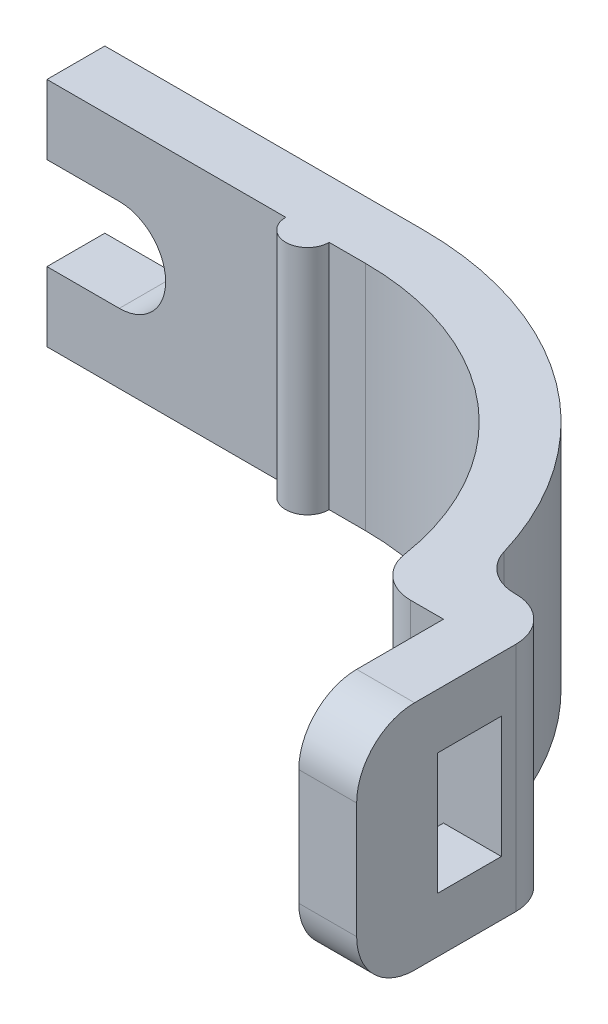
ISO-10303-21;
HEADER;
FILE_DESCRIPTION(('STEP AP214'),'2;1');
FILE_NAME('part.step','',(''),(''),'','','');
FILE_SCHEMA(('AUTOMOTIVE_DESIGN { 1 0 10303 214 1 1 1 1 }'));
ENDSEC;
DATA;
#1=APPLICATION_CONTEXT('core data for automotive mechanical design processes');
#2=APPLICATION_PROTOCOL_DEFINITION('international standard','automotive_design',2000,#1);
#3=PRODUCT_CONTEXT('',#1,'mechanical');
#4=PRODUCT('Part','Part','',(#3));
#5=PRODUCT_RELATED_PRODUCT_CATEGORY('part','',(#4));
#6=PRODUCT_DEFINITION_FORMATION('','',#4);
#7=PRODUCT_DEFINITION_CONTEXT('part definition',#1,'design');
#8=PRODUCT_DEFINITION('design','',#6,#7);
#9=PRODUCT_DEFINITION_SHAPE('','',#8);
#10=(LENGTH_UNIT() NAMED_UNIT(*) SI_UNIT(.MILLI.,.METRE.));
#11=(NAMED_UNIT(*) PLANE_ANGLE_UNIT() SI_UNIT($,.RADIAN.));
#12=(NAMED_UNIT(*) SI_UNIT($,.STERADIAN.) SOLID_ANGLE_UNIT());
#13=UNCERTAINTY_MEASURE_WITH_UNIT(LENGTH_MEASURE(1.E-05),#10,'distance_accuracy_value','');
#14=(GEOMETRIC_REPRESENTATION_CONTEXT(3) GLOBAL_UNCERTAINTY_ASSIGNED_CONTEXT((#13)) GLOBAL_UNIT_ASSIGNED_CONTEXT((#10,
#11,#12)) REPRESENTATION_CONTEXT('',''));
#15=CARTESIAN_POINT('',(0.,0.,0.));
#16=DIRECTION('',(0.,0.,1.));
#17=DIRECTION('',(1.,0.,0.));
#18=AXIS2_PLACEMENT_3D('',#15,#16,#17);
#19=CARTESIAN_POINT('',(0.,8.,-9.5));
#20=DIRECTION('',(0.,0.,1.));
#21=DIRECTION('',(1.,0.,0.));
#22=AXIS2_PLACEMENT_3D('',#19,#20,#21);
#23=PLANE('',#22);
#24=DIRECTION('',(0.,1.,0.));
#25=VECTOR('',#24,1.);
#26=CARTESIAN_POINT('',(-1.25,-2.12132034355965,-9.5));
#27=LINE('',#26,#25);
#28=CARTESIAN_POINT('',(-1.25,0.,-9.5));
#29=VERTEX_POINT('',#28);
#30=CARTESIAN_POINT('',(-1.25,8.,-9.5));
#31=VERTEX_POINT('',#30);
#32=EDGE_CURVE('E206',#29,#31,#27,.T.);
#33=ORIENTED_EDGE('',*,*,#32,.F.);
#34=DIRECTION('',(-1.,0.,0.));
#35=VECTOR('',#34,1.);
#36=CARTESIAN_POINT('',(0.,0.,-9.5));
#37=LINE('',#36,#35);
#38=CARTESIAN_POINT('',(0.,0.,-9.5));
#39=VERTEX_POINT('',#38);
#40=EDGE_CURVE('E217',#39,#29,#37,.T.);
#41=ORIENTED_EDGE('',*,*,#40,.F.);
#42=DIRECTION('',(0.,-1.,0.));
#43=VECTOR('',#42,1.);
#44=CARTESIAN_POINT('',(0.,8.,-9.5));
#45=LINE('',#44,#43);
#46=CARTESIAN_POINT('',(0.,8.,-9.5));
#47=VERTEX_POINT('',#46);
#48=EDGE_CURVE('E259',#47,#39,#45,.T.);
#49=ORIENTED_EDGE('',*,*,#48,.F.);
#50=DIRECTION('',(-1.,0.,0.));
#51=VECTOR('',#50,1.);
#52=CARTESIAN_POINT('',(0.,8.,-9.5));
#53=LINE('',#52,#51);
#54=EDGE_CURVE('E219',#47,#31,#53,.T.);
#55=ORIENTED_EDGE('',*,*,#54,.T.);
#56=EDGE_LOOP('',(#33,#41,#49,#55));
#57=FACE_BOUND('',#56,.T.);
#58=ADVANCED_FACE('F38',(#57),#23,.T.);
#59=CARTESIAN_POINT('',(-11.,8.,-9.5));
#60=DIRECTION('',(-1.,0.,0.));
#61=DIRECTION('',(0.,0.,1.));
#62=AXIS2_PLACEMENT_3D('',#59,#60,#61);
#63=PLANE('',#62);
#64=DIRECTION('',(0.,0.,-1.));
#65=VECTOR('',#64,1.);
#66=CARTESIAN_POINT('',(-11.,2.4,4.801));
#67=LINE('',#66,#65);
#68=CARTESIAN_POINT('',(-11.,2.4,-9.5));
#69=VERTEX_POINT('',#68);
#70=CARTESIAN_POINT('',(-11.,2.4,-11.5));
#71=VERTEX_POINT('',#70);
#72=EDGE_CURVE('E378',#69,#71,#67,.T.);
#73=ORIENTED_EDGE('',*,*,#72,.T.);
#74=DIRECTION('',(0.,-1.,0.));
#75=VECTOR('',#74,1.);
#76=CARTESIAN_POINT('',(-11.,8.,-11.5));
#77=LINE('',#76,#75);
#78=CARTESIAN_POINT('',(-11.,0.,-11.5));
#79=VERTEX_POINT('',#78);
#80=EDGE_CURVE('E265',#71,#79,#77,.T.);
#81=ORIENTED_EDGE('',*,*,#80,.T.);
#82=DIRECTION('',(0.,0.,-1.));
#83=VECTOR('',#82,1.);
#84=CARTESIAN_POINT('',(-11.,0.,-9.5));
#85=LINE('',#84,#83);
#86=CARTESIAN_POINT('',(-11.,0.,-9.5));
#87=VERTEX_POINT('',#86);
#88=EDGE_CURVE('E230',#87,#79,#85,.T.);
#89=ORIENTED_EDGE('',*,*,#88,.F.);
#90=DIRECTION('',(0.,-1.,0.));
#91=VECTOR('',#90,1.);
#92=CARTESIAN_POINT('',(-11.,8.,-9.5));
#93=LINE('',#92,#91);
#94=EDGE_CURVE('E261',#69,#87,#93,.T.);
#95=ORIENTED_EDGE('',*,*,#94,.F.);
#96=EDGE_LOOP('',(#73,#81,#89,#95));
#97=FACE_BOUND('',#96,.T.);
#98=ADVANCED_FACE('F442',(#97),#63,.T.);
#99=CARTESIAN_POINT('',(0.,8.,-11.5));
#100=DIRECTION('',(0.,0.,1.));
#101=DIRECTION('',(1.,0.,0.));
#102=AXIS2_PLACEMENT_3D('',#99,#100,#101);
#103=PLANE('',#102);
#104=ORIENTED_EDGE('',*,*,#80,.F.);
#105=DIRECTION('',(-1.,0.,0.));
#106=VECTOR('',#105,1.);
#107=CARTESIAN_POINT('',(-11.,2.4,-11.5));
#108=LINE('',#107,#106);
#109=CARTESIAN_POINT('',(-8.5,2.4,-11.5));
#110=VERTEX_POINT('',#109);
#111=EDGE_CURVE('E393',#110,#71,#108,.T.);
#112=ORIENTED_EDGE('',*,*,#111,.F.);
#113=CARTESIAN_POINT('',(-8.5,4.,-11.5));
#114=DIRECTION('',(0.,0.,-1.));
#115=DIRECTION('',(-1.,0.,0.));
#116=AXIS2_PLACEMENT_3D('',#113,#114,#115);
#117=CIRCLE('',#116,1.6);
#118=CARTESIAN_POINT('',(-8.5,5.6,-11.5));
#119=VERTEX_POINT('',#118);
#120=EDGE_CURVE('E390',#119,#110,#117,.T.);
#121=ORIENTED_EDGE('',*,*,#120,.F.);
#122=DIRECTION('',(1.,0.,0.));
#123=VECTOR('',#122,1.);
#124=CARTESIAN_POINT('',(-11.,5.6,-11.5));
#125=LINE('',#124,#123);
#126=CARTESIAN_POINT('',(-11.,5.6,-11.5));
#127=VERTEX_POINT('',#126);
#128=EDGE_CURVE('E387',#127,#119,#125,.T.);
#129=ORIENTED_EDGE('',*,*,#128,.F.);
#130=CARTESIAN_POINT('',(-11.,8.,-11.5));
#131=VERTEX_POINT('',#130);
#132=EDGE_CURVE('E266',#131,#127,#77,.T.);
#133=ORIENTED_EDGE('',*,*,#132,.F.);
#134=DIRECTION('',(-1.,0.,0.));
#135=VECTOR('',#134,1.);
#136=CARTESIAN_POINT('',(0.,8.,-11.5));
#137=LINE('',#136,#135);
#138=CARTESIAN_POINT('',(0.,8.,-11.5));
#139=VERTEX_POINT('',#138);
#140=EDGE_CURVE('E245',#139,#131,#137,.T.);
#141=ORIENTED_EDGE('',*,*,#140,.F.);
#142=DIRECTION('',(0.,-1.,0.));
#143=VECTOR('',#142,1.);
#144=CARTESIAN_POINT('',(0.,8.,-11.5));
#145=LINE('',#144,#143);
#146=CARTESIAN_POINT('',(0.,0.,-11.5));
#147=VERTEX_POINT('',#146);
#148=EDGE_CURVE('E246',#139,#147,#145,.T.);
#149=ORIENTED_EDGE('',*,*,#148,.T.);
#150=DIRECTION('',(-1.,0.,0.));
#151=VECTOR('',#150,1.);
#152=CARTESIAN_POINT('',(0.,0.,-11.5));
#153=LINE('',#152,#151);
#154=EDGE_CURVE('E342',#147,#79,#153,.T.);
#155=ORIENTED_EDGE('',*,*,#154,.T.);
#156=EDGE_LOOP('',(#104,#112,#121,#129,#133,#141,#149,#155));
#157=FACE_BOUND('',#156,.T.);
#158=ADVANCED_FACE('F448',(#157),#103,.F.);
#159=DIRECTION('',(0.,0.,1.));
#160=VECTOR('',#159,1.);
#161=CARTESIAN_POINT('',(-11.,5.6,4.801));
#162=LINE('',#161,#160);
#163=CARTESIAN_POINT('',(-11.,5.6,-9.5));
#164=VERTEX_POINT('',#163);
#165=EDGE_CURVE('E220',#127,#164,#162,.T.);
#166=ORIENTED_EDGE('',*,*,#165,.T.);
#167=CARTESIAN_POINT('',(-11.,8.,-9.5));
#168=VERTEX_POINT('',#167);
#169=EDGE_CURVE('E262',#168,#164,#93,.T.);
#170=ORIENTED_EDGE('',*,*,#169,.F.);
#171=DIRECTION('',(0.,0.,-1.));
#172=VECTOR('',#171,1.);
#173=CARTESIAN_POINT('',(-11.,8.,-9.5));
#174=LINE('',#173,#172);
#175=EDGE_CURVE('E363',#168,#131,#174,.T.);
#176=ORIENTED_EDGE('',*,*,#175,.T.);
#177=ORIENTED_EDGE('',*,*,#132,.T.);
#178=EDGE_LOOP('',(#166,#170,#176,#177));
#179=FACE_BOUND('',#178,.T.);
#180=ADVANCED_FACE('F451',(#179),#63,.T.);
#181=DIRECTION('',(0.,1.,0.));
#182=VECTOR('',#181,1.);
#183=CARTESIAN_POINT('',(-2.75,-2.12132034355965,-9.5));
#184=LINE('',#183,#182);
#185=CARTESIAN_POINT('',(-2.75,8.,-9.5));
#186=VERTEX_POINT('',#185);
#187=CARTESIAN_POINT('',(-2.75,0.,-9.5));
#188=VERTEX_POINT('',#187);
#189=EDGE_CURVE('E209',#186,#188,#184,.F.);
#190=ORIENTED_EDGE('',*,*,#189,.F.);
#191=EDGE_CURVE('E366',#186,#168,#53,.T.);
#192=ORIENTED_EDGE('',*,*,#191,.T.);
#193=ORIENTED_EDGE('',*,*,#169,.T.);
#194=DIRECTION('',(1.,0.,0.));
#195=VECTOR('',#194,1.);
#196=CARTESIAN_POINT('',(-11.,5.6,-9.5));
#197=LINE('',#196,#195);
#198=CARTESIAN_POINT('',(-8.5,5.6,-9.5));
#199=VERTEX_POINT('',#198);
#200=EDGE_CURVE('E398',#164,#199,#197,.T.);
#201=ORIENTED_EDGE('',*,*,#200,.T.);
#202=CARTESIAN_POINT('',(-8.5,4.,-9.5));
#203=DIRECTION('',(0.,0.,1.));
#204=DIRECTION('',(1.,0.,0.));
#205=AXIS2_PLACEMENT_3D('',#202,#203,#204);
#206=CIRCLE('',#205,1.6);
#207=CARTESIAN_POINT('',(-8.5,2.4,-9.5));
#208=VERTEX_POINT('',#207);
#209=EDGE_CURVE('E381',#199,#208,#206,.F.);
#210=ORIENTED_EDGE('',*,*,#209,.T.);
#211=DIRECTION('',(-1.,0.,0.));
#212=VECTOR('',#211,1.);
#213=CARTESIAN_POINT('',(-11.,2.4,-9.5));
#214=LINE('',#213,#212);
#215=EDGE_CURVE('E384',#208,#69,#214,.T.);
#216=ORIENTED_EDGE('',*,*,#215,.T.);
#217=ORIENTED_EDGE('',*,*,#94,.T.);
#218=EDGE_CURVE('E226',#188,#87,#37,.T.);
#219=ORIENTED_EDGE('',*,*,#218,.F.);
#220=EDGE_LOOP('',(#190,#192,#193,#201,#210,#216,#217,#219));
#221=FACE_BOUND('',#220,.T.);
#222=ADVANCED_FACE('F444',(#221),#23,.T.);
#223=CARTESIAN_POINT('',(0.,8.,0.));
#224=DIRECTION('',(0.,-1.,0.));
#225=DIRECTION('',(0.,0.,-1.));
#226=AXIS2_PLACEMENT_3D('',#223,#224,#225);
#227=CYLINDRICAL_SURFACE('',#226,9.5);
#228=CARTESIAN_POINT('',(0.,0.,0.));
#229=DIRECTION('',(0.,1.,0.));
#230=DIRECTION('',(0.,0.,1.));
#231=AXIS2_PLACEMENT_3D('',#228,#229,#230);
#232=CIRCLE('',#231,9.5);
#233=CARTESIAN_POINT('',(9.38586395324162,0.,-1.46818181818182));
#234=VERTEX_POINT('',#233);
#235=EDGE_CURVE('E224',#234,#39,#232,.T.);
#236=ORIENTED_EDGE('',*,*,#235,.F.);
#237=DIRECTION('',(0.,-1.,0.));
#238=VECTOR('',#237,1.);
#239=CARTESIAN_POINT('',(9.38586395324162,8.,-1.46818181818182));
#240=LINE('',#239,#238);
#241=CARTESIAN_POINT('',(9.38586395324162,8.,-1.46818181818182));
#242=VERTEX_POINT('',#241);
#243=EDGE_CURVE('E292',#234,#242,#240,.F.);
#244=ORIENTED_EDGE('',*,*,#243,.T.);
#245=CARTESIAN_POINT('',(0.,8.,0.));
#246=DIRECTION('',(0.,1.,0.));
#247=DIRECTION('',(0.,0.,1.));
#248=AXIS2_PLACEMENT_3D('',#245,#246,#247);
#249=CIRCLE('',#248,9.5);
#250=EDGE_CURVE('E336',#242,#47,#249,.T.);
#251=ORIENTED_EDGE('',*,*,#250,.T.);
#252=ORIENTED_EDGE('',*,*,#48,.T.);
#253=EDGE_LOOP('',(#236,#244,#251,#252));
#254=FACE_BOUND('',#253,.T.);
#255=ADVANCED_FACE('F369',(#254),#227,.F.);
#256=CARTESIAN_POINT('',(9.49789450352024,8.,-0.2));
#257=DIRECTION('',(0.,0.,1.));
#258=DIRECTION('',(1.,0.,0.));
#259=AXIS2_PLACEMENT_3D('',#256,#257,#258);
#260=PLANE('',#259);
#261=DIRECTION('',(-1.,0.,0.));
#262=VECTOR('',#261,1.);
#263=CARTESIAN_POINT('',(9.49789450352024,8.,-0.2));
#264=LINE('',#263,#262);
#265=CARTESIAN_POINT('',(12.,8.,-0.2));
#266=VERTEX_POINT('',#265);
#267=CARTESIAN_POINT('',(10.8678424721745,8.,-0.2));
#268=VERTEX_POINT('',#267);
#269=EDGE_CURVE('E332',#266,#268,#264,.T.);
#270=ORIENTED_EDGE('',*,*,#269,.T.);
#271=DIRECTION('',(0.,-1.,0.));
#272=VECTOR('',#271,1.);
#273=CARTESIAN_POINT('',(10.8678424721745,8.,-0.2));
#274=LINE('',#273,#272);
#275=CARTESIAN_POINT('',(10.8678424721745,0.,-0.2));
#276=VERTEX_POINT('',#275);
#277=EDGE_CURVE('E289',#268,#276,#274,.T.);
#278=ORIENTED_EDGE('',*,*,#277,.T.);
#279=DIRECTION('',(-1.,0.,0.));
#280=VECTOR('',#279,1.);
#281=CARTESIAN_POINT('',(9.49789450352024,0.,-0.2));
#282=LINE('',#281,#280);
#283=CARTESIAN_POINT('',(12.,0.,-0.2));
#284=VERTEX_POINT('',#283);
#285=EDGE_CURVE('E228',#284,#276,#282,.T.);
#286=ORIENTED_EDGE('',*,*,#285,.F.);
#287=DIRECTION('',(0.,-1.,0.));
#288=VECTOR('',#287,1.);
#289=CARTESIAN_POINT('',(12.,8.,-0.2));
#290=LINE('',#289,#288);
#291=CARTESIAN_POINT('',(12.,1.9,-0.2));
#292=VERTEX_POINT('',#291);
#293=EDGE_CURVE('E255',#292,#284,#290,.T.);
#294=ORIENTED_EDGE('',*,*,#293,.F.);
#295=DIRECTION('',(-1.,0.,0.));
#296=VECTOR('',#295,1.);
#297=CARTESIAN_POINT('',(14.001,1.9,-0.199999999999999));
#298=LINE('',#297,#296);
#299=CARTESIAN_POINT('',(14.,1.9,-0.199999999999999));
#300=VERTEX_POINT('',#299);
#301=EDGE_CURVE('E360',#300,#292,#298,.T.);
#302=ORIENTED_EDGE('',*,*,#301,.F.);
#303=DIRECTION('',(0.,1.,0.));
#304=VECTOR('',#303,1.);
#305=CARTESIAN_POINT('',(14.,6.1,-0.2));
#306=LINE('',#305,#304);
#307=CARTESIAN_POINT('',(14.,6.1,-0.2));
#308=VERTEX_POINT('',#307);
#309=EDGE_CURVE('E407',#300,#308,#306,.T.);
#310=ORIENTED_EDGE('',*,*,#309,.T.);
#311=DIRECTION('',(-1.,0.,0.));
#312=VECTOR('',#311,1.);
#313=CARTESIAN_POINT('',(14.001,6.1,-0.2));
#314=LINE('',#313,#312);
#315=CARTESIAN_POINT('',(12.,6.1,-0.2));
#316=VERTEX_POINT('',#315);
#317=EDGE_CURVE('E350',#308,#316,#314,.T.);
#318=ORIENTED_EDGE('',*,*,#317,.T.);
#319=EDGE_CURVE('E256',#266,#316,#290,.T.);
#320=ORIENTED_EDGE('',*,*,#319,.F.);
#321=EDGE_LOOP('',(#270,#278,#286,#294,#302,#310,#318,#320));
#322=FACE_BOUND('',#321,.T.);
#323=ADVANCED_FACE('F430',(#322),#260,.T.);
#324=CARTESIAN_POINT('',(12.,8.,-0.2));
#325=DIRECTION('',(-1.,0.,0.));
#326=DIRECTION('',(0.,0.,1.));
#327=AXIS2_PLACEMENT_3D('',#324,#325,#326);
#328=PLANE('',#327);
#329=DIRECTION('',(0.,-1.,0.));
#330=VECTOR('',#329,1.);
#331=CARTESIAN_POINT('',(12.,8.,4.8));
#332=LINE('',#331,#330);
#333=CARTESIAN_POINT('',(12.,6.,4.8));
#334=VERTEX_POINT('',#333);
#335=CARTESIAN_POINT('',(12.,2.,4.8));
#336=VERTEX_POINT('',#335);
#337=EDGE_CURVE('E252',#334,#336,#332,.T.);
#338=ORIENTED_EDGE('',*,*,#337,.F.);
#339=CARTESIAN_POINT('',(12.,6.,2.8));
#340=DIRECTION('',(-1.,0.,0.));
#341=DIRECTION('',(0.,0.,1.));
#342=AXIS2_PLACEMENT_3D('',#339,#340,#341);
#343=CIRCLE('',#342,2.);
#344=CARTESIAN_POINT('',(12.,8.,2.8));
#345=VERTEX_POINT('',#344);
#346=EDGE_CURVE('E305',#334,#345,#343,.T.);
#347=ORIENTED_EDGE('',*,*,#346,.T.);
#348=DIRECTION('',(0.,0.,-1.));
#349=VECTOR('',#348,1.);
#350=CARTESIAN_POINT('',(12.,8.,-0.2));
#351=LINE('',#350,#349);
#352=EDGE_CURVE('E325',#345,#266,#351,.T.);
#353=ORIENTED_EDGE('',*,*,#352,.T.);
#354=ORIENTED_EDGE('',*,*,#319,.T.);
#355=DIRECTION('',(0.,0.,-1.));
#356=VECTOR('',#355,1.);
#357=CARTESIAN_POINT('',(12.,6.1,-0.2));
#358=LINE('',#357,#356);
#359=CARTESIAN_POINT('',(12.,6.1,2.));
#360=VERTEX_POINT('',#359);
#361=EDGE_CURVE('E416',#360,#316,#358,.T.);
#362=ORIENTED_EDGE('',*,*,#361,.F.);
#363=DIRECTION('',(0.,1.,0.));
#364=VECTOR('',#363,1.);
#365=CARTESIAN_POINT('',(12.,6.1,2.));
#366=LINE('',#365,#364);
#367=CARTESIAN_POINT('',(12.,1.9,2.));
#368=VERTEX_POINT('',#367);
#369=EDGE_CURVE('E413',#368,#360,#366,.T.);
#370=ORIENTED_EDGE('',*,*,#369,.F.);
#371=DIRECTION('',(0.,0.,1.));
#372=VECTOR('',#371,1.);
#373=CARTESIAN_POINT('',(12.,1.9,-0.199999999999999));
#374=LINE('',#373,#372);
#375=EDGE_CURVE('E410',#292,#368,#374,.T.);
#376=ORIENTED_EDGE('',*,*,#375,.F.);
#377=ORIENTED_EDGE('',*,*,#293,.T.);
#378=DIRECTION('',(0.,0.,-1.));
#379=VECTOR('',#378,1.);
#380=CARTESIAN_POINT('',(12.,0.,-0.2));
#381=LINE('',#380,#379);
#382=CARTESIAN_POINT('',(12.,0.,2.8));
#383=VERTEX_POINT('',#382);
#384=EDGE_CURVE('E236',#383,#284,#381,.T.);
#385=ORIENTED_EDGE('',*,*,#384,.F.);
#386=CARTESIAN_POINT('',(12.,2.,2.8));
#387=DIRECTION('',(-1.,0.,0.));
#388=DIRECTION('',(0.,0.,1.));
#389=AXIS2_PLACEMENT_3D('',#386,#387,#388);
#390=CIRCLE('',#389,2.);
#391=EDGE_CURVE('E303',#383,#336,#390,.T.);
#392=ORIENTED_EDGE('',*,*,#391,.T.);
#393=EDGE_LOOP('',(#338,#347,#353,#354,#362,#370,#376,#377,#385,#392));
#394=FACE_BOUND('',#393,.T.);
#395=ADVANCED_FACE('F324',(#394),#328,.T.);
#396=CARTESIAN_POINT('',(14.,8.,4.8));
#397=DIRECTION('',(0.,0.,1.));
#398=DIRECTION('',(1.,0.,0.));
#399=AXIS2_PLACEMENT_3D('',#396,#397,#398);
#400=PLANE('',#399);
#401=DIRECTION('',(0.,-1.,0.));
#402=VECTOR('',#401,1.);
#403=CARTESIAN_POINT('',(14.,8.,4.8));
#404=LINE('',#403,#402);
#405=CARTESIAN_POINT('',(14.,6.,4.8));
#406=VERTEX_POINT('',#405);
#407=CARTESIAN_POINT('',(14.,2.,4.8));
#408=VERTEX_POINT('',#407);
#409=EDGE_CURVE('E249',#406,#408,#404,.T.);
#410=ORIENTED_EDGE('',*,*,#409,.F.);
#411=DIRECTION('',(-1.,0.,0.));
#412=VECTOR('',#411,1.);
#413=CARTESIAN_POINT('',(14.,6.,4.8));
#414=LINE('',#413,#412);
#415=EDGE_CURVE('E300',#406,#334,#414,.T.);
#416=ORIENTED_EDGE('',*,*,#415,.T.);
#417=ORIENTED_EDGE('',*,*,#337,.T.);
#418=DIRECTION('',(-1.,0.,0.));
#419=VECTOR('',#418,1.);
#420=CARTESIAN_POINT('',(14.,2.,4.8));
#421=LINE('',#420,#419);
#422=EDGE_CURVE('E298',#336,#408,#421,.F.);
#423=ORIENTED_EDGE('',*,*,#422,.T.);
#424=EDGE_LOOP('',(#410,#416,#417,#423));
#425=FACE_BOUND('',#424,.T.);
#426=ADVANCED_FACE('F318',(#425),#400,.T.);
#427=CARTESIAN_POINT('',(14.,8.,-0.2));
#428=DIRECTION('',(-1.,0.,0.));
#429=DIRECTION('',(0.,0.,1.));
#430=AXIS2_PLACEMENT_3D('',#427,#428,#429);
#431=PLANE('',#430);
#432=DIRECTION('',(0.,0.,1.));
#433=VECTOR('',#432,1.);
#434=CARTESIAN_POINT('',(14.,6.1,-0.2));
#435=LINE('',#434,#433);
#436=CARTESIAN_POINT('',(14.,6.1,2.));
#437=VERTEX_POINT('',#436);
#438=EDGE_CURVE('E404',#308,#437,#435,.T.);
#439=ORIENTED_EDGE('',*,*,#438,.F.);
#440=ORIENTED_EDGE('',*,*,#309,.F.);
#441=DIRECTION('',(0.,0.,-1.));
#442=VECTOR('',#441,1.);
#443=CARTESIAN_POINT('',(14.,1.9,-0.199999999999999));
#444=LINE('',#443,#442);
#445=CARTESIAN_POINT('',(14.,1.9,2.));
#446=VERTEX_POINT('',#445);
#447=EDGE_CURVE('E344',#446,#300,#444,.T.);
#448=ORIENTED_EDGE('',*,*,#447,.F.);
#449=DIRECTION('',(0.,-1.,0.));
#450=VECTOR('',#449,1.);
#451=CARTESIAN_POINT('',(14.,6.1,2.));
#452=LINE('',#451,#450);
#453=EDGE_CURVE('E402',#437,#446,#452,.T.);
#454=ORIENTED_EDGE('',*,*,#453,.F.);
#455=EDGE_LOOP('',(#439,#440,#448,#454));
#456=FACE_BOUND('',#455,.T.);
#457=DIRECTION('',(0.,0.,-1.));
#458=VECTOR('',#457,1.);
#459=CARTESIAN_POINT('',(14.,8.,-0.2));
#460=LINE('',#459,#458);
#461=CARTESIAN_POINT('',(14.,8.,2.8));
#462=VERTEX_POINT('',#461);
#463=CARTESIAN_POINT('',(14.,8.,-0.7));
#464=VERTEX_POINT('',#463);
#465=EDGE_CURVE('E313',#462,#464,#460,.T.);
#466=ORIENTED_EDGE('',*,*,#465,.F.);
#467=CARTESIAN_POINT('',(14.,6.,2.8));
#468=DIRECTION('',(-1.,0.,0.));
#469=DIRECTION('',(0.,0.,1.));
#470=AXIS2_PLACEMENT_3D('',#467,#468,#469);
#471=CIRCLE('',#470,2.);
#472=EDGE_CURVE('E46',#462,#406,#471,.F.);
#473=ORIENTED_EDGE('',*,*,#472,.T.);
#474=ORIENTED_EDGE('',*,*,#409,.T.);
#475=CARTESIAN_POINT('',(14.,2.,2.8));
#476=DIRECTION('',(-1.,0.,0.));
#477=DIRECTION('',(0.,0.,1.));
#478=AXIS2_PLACEMENT_3D('',#475,#476,#477);
#479=CIRCLE('',#478,2.);
#480=CARTESIAN_POINT('',(14.,0.,2.8));
#481=VERTEX_POINT('',#480);
#482=EDGE_CURVE('E61',#408,#481,#479,.F.);
#483=ORIENTED_EDGE('',*,*,#482,.T.);
#484=DIRECTION('',(0.,0.,-1.));
#485=VECTOR('',#484,1.);
#486=CARTESIAN_POINT('',(14.,0.,-0.2));
#487=LINE('',#486,#485);
#488=CARTESIAN_POINT('',(14.,0.,-0.7));
#489=VERTEX_POINT('',#488);
#490=EDGE_CURVE('E238',#481,#489,#487,.T.);
#491=ORIENTED_EDGE('',*,*,#490,.T.);
#492=DIRECTION('',(0.,-1.,0.));
#493=VECTOR('',#492,1.);
#494=CARTESIAN_POINT('',(14.,8.,-0.7));
#495=LINE('',#494,#493);
#496=EDGE_CURVE('E279',#489,#464,#495,.F.);
#497=ORIENTED_EDGE('',*,*,#496,.T.);
#498=EDGE_LOOP('',(#466,#473,#474,#483,#491,#497));
#499=FACE_BOUND('',#498,.T.);
#500=ADVANCED_FACE('F312',(#456,#499),#431,.F.);
#501=CARTESIAN_POINT('',(9.49789450352024,8.,-2.2));
#502=DIRECTION('',(0.,0.,1.));
#503=DIRECTION('',(1.,0.,0.));
#504=AXIS2_PLACEMENT_3D('',#501,#502,#503);
#505=PLANE('',#504);
#506=DIRECTION('',(1.,0.,0.));
#507=VECTOR('',#506,1.);
#508=CARTESIAN_POINT('',(9.49789450352024,8.,-2.2));
#509=LINE('',#508,#507);
#510=CARTESIAN_POINT('',(12.5,8.,-2.2));
#511=VERTEX_POINT('',#510);
#512=CARTESIAN_POINT('',(12.4623432788541,8.,-2.2));
#513=VERTEX_POINT('',#512);
#514=EDGE_CURVE('E334',#511,#513,#509,.F.);
#515=ORIENTED_EDGE('',*,*,#514,.F.);
#516=DIRECTION('',(0.,-1.,0.));
#517=VECTOR('',#516,1.);
#518=CARTESIAN_POINT('',(12.5,8.,-2.2));
#519=LINE('',#518,#517);
#520=CARTESIAN_POINT('',(12.5,0.,-2.2));
#521=VERTEX_POINT('',#520);
#522=EDGE_CURVE('E271',#511,#521,#519,.T.);
#523=ORIENTED_EDGE('',*,*,#522,.T.);
#524=DIRECTION('',(1.,0.,0.));
#525=VECTOR('',#524,1.);
#526=CARTESIAN_POINT('',(9.49789450352024,0.,-2.2));
#527=LINE('',#526,#525);
#528=CARTESIAN_POINT('',(12.4623432788541,0.,-2.2));
#529=VERTEX_POINT('',#528);
#530=EDGE_CURVE('E240',#521,#529,#527,.F.);
#531=ORIENTED_EDGE('',*,*,#530,.T.);
#532=DIRECTION('',(0.,1.,0.));
#533=VECTOR('',#532,1.);
#534=CARTESIAN_POINT('',(12.4623432788541,8.,-2.2));
#535=LINE('',#534,#533);
#536=EDGE_CURVE('E269',#529,#513,#535,.T.);
#537=ORIENTED_EDGE('',*,*,#536,.T.);
#538=EDGE_LOOP('',(#515,#523,#531,#537));
#539=FACE_BOUND('',#538,.T.);
#540=ADVANCED_FACE('F488',(#539),#505,.F.);
#541=CARTESIAN_POINT('',(0.,8.,0.));
#542=DIRECTION('',(0.,-1.,0.));
#543=DIRECTION('',(0.,0.,-1.));
#544=AXIS2_PLACEMENT_3D('',#541,#542,#543);
#545=CYLINDRICAL_SURFACE('',#544,11.5);
#546=CARTESIAN_POINT('',(0.,8.,0.));
#547=DIRECTION('',(0.,1.,0.));
#548=DIRECTION('',(1.,0.,0.));
#549=AXIS2_PLACEMENT_3D('',#546,#547,#548);
#550=CIRCLE('',#549,11.5);
#551=CARTESIAN_POINT('',(11.0243805928325,8.,-3.27307692307692));
#552=VERTEX_POINT('',#551);
#553=EDGE_CURVE('E250',#552,#139,#550,.T.);
#554=ORIENTED_EDGE('',*,*,#553,.F.);
#555=DIRECTION('',(0.,-1.,0.));
#556=VECTOR('',#555,1.);
#557=CARTESIAN_POINT('',(11.0243805928325,8.,-3.27307692307692));
#558=LINE('',#557,#556);
#559=CARTESIAN_POINT('',(11.0243805928325,0.,-3.27307692307692));
#560=VERTEX_POINT('',#559);
#561=EDGE_CURVE('E286',#552,#560,#558,.T.);
#562=ORIENTED_EDGE('',*,*,#561,.T.);
#563=CARTESIAN_POINT('',(0.,0.,0.));
#564=DIRECTION('',(0.,1.,0.));
#565=DIRECTION('',(1.,0.,0.));
#566=AXIS2_PLACEMENT_3D('',#563,#564,#565);
#567=CIRCLE('',#566,11.5);
#568=EDGE_CURVE('E243',#560,#147,#567,.T.);
#569=ORIENTED_EDGE('',*,*,#568,.T.);
#570=ORIENTED_EDGE('',*,*,#148,.F.);
#571=EDGE_LOOP('',(#554,#562,#569,#570));
#572=FACE_BOUND('',#571,.T.);
#573=ADVANCED_FACE('F481',(#572),#545,.T.);
#574=CARTESIAN_POINT('',(0.,8.,0.));
#575=DIRECTION('',(0.,1.,0.));
#576=DIRECTION('',(1.,0.,0.));
#577=AXIS2_PLACEMENT_3D('',#574,#575,#576);
#578=PLANE('',#577);
#579=ORIENTED_EDGE('',*,*,#191,.F.);
#580=CARTESIAN_POINT('',(-2.,8.,-9.5));
#581=DIRECTION('',(0.,1.,0.));
#582=DIRECTION('',(0.,0.,1.));
#583=AXIS2_PLACEMENT_3D('',#580,#581,#582);
#584=CIRCLE('',#583,0.750000000000001);
#585=EDGE_CURVE('E211',#186,#31,#584,.T.);
#586=ORIENTED_EDGE('',*,*,#585,.T.);
#587=ORIENTED_EDGE('',*,*,#54,.F.);
#588=ORIENTED_EDGE('',*,*,#250,.F.);
#589=CARTESIAN_POINT('',(10.8678424721745,8.,-1.7));
#590=DIRECTION('',(0.,1.,0.));
#591=DIRECTION('',(0.,0.,1.));
#592=AXIS2_PLACEMENT_3D('',#589,#590,#591);
#593=CIRCLE('',#592,1.5);
#594=EDGE_CURVE('E282',#242,#268,#593,.T.);
#595=ORIENTED_EDGE('',*,*,#594,.T.);
#596=ORIENTED_EDGE('',*,*,#269,.F.);
#597=ORIENTED_EDGE('',*,*,#352,.F.);
#598=DIRECTION('',(-1.,0.,0.));
#599=VECTOR('',#598,1.);
#600=CARTESIAN_POINT('',(0.,8.,2.8));
#601=LINE('',#600,#599);
#602=EDGE_CURVE('E307',#345,#462,#601,.F.);
#603=ORIENTED_EDGE('',*,*,#602,.T.);
#604=ORIENTED_EDGE('',*,*,#465,.T.);
#605=CARTESIAN_POINT('',(12.5,8.,-0.7));
#606=DIRECTION('',(0.,1.,0.));
#607=DIRECTION('',(0.,0.,1.));
#608=AXIS2_PLACEMENT_3D('',#605,#606,#607);
#609=CIRCLE('',#608,1.5);
#610=EDGE_CURVE('E284',#464,#511,#609,.T.);
#611=ORIENTED_EDGE('',*,*,#610,.T.);
#612=ORIENTED_EDGE('',*,*,#514,.T.);
#613=CARTESIAN_POINT('',(12.4623432788541,8.,-3.7));
#614=DIRECTION('',(0.,1.,0.));
#615=DIRECTION('',(0.,0.,1.));
#616=AXIS2_PLACEMENT_3D('',#613,#614,#615);
#617=CIRCLE('',#616,1.5);
#618=EDGE_CURVE('E296',#513,#552,#617,.F.);
#619=ORIENTED_EDGE('',*,*,#618,.T.);
#620=ORIENTED_EDGE('',*,*,#553,.T.);
#621=ORIENTED_EDGE('',*,*,#140,.T.);
#622=ORIENTED_EDGE('',*,*,#175,.F.);
#623=EDGE_LOOP('',(#579,#586,#587,#588,#595,#596,#597,#603,#604,#611,#612,#619,#620,#621,#622));
#624=FACE_BOUND('',#623,.T.);
#625=ADVANCED_FACE('F330',(#624),#578,.T.);
#626=CARTESIAN_POINT('',(0.,0.,0.));
#627=DIRECTION('',(0.,1.,0.));
#628=DIRECTION('',(1.,0.,0.));
#629=AXIS2_PLACEMENT_3D('',#626,#627,#628);
#630=PLANE('',#629);
#631=ORIENTED_EDGE('',*,*,#40,.T.);
#632=CARTESIAN_POINT('',(-2.,0.,-9.5));
#633=DIRECTION('',(0.,1.,0.));
#634=DIRECTION('',(0.,0.,1.));
#635=AXIS2_PLACEMENT_3D('',#632,#633,#634);
#636=CIRCLE('',#635,0.750000000000001);
#637=EDGE_CURVE('E53',#29,#188,#636,.F.);
#638=ORIENTED_EDGE('',*,*,#637,.T.);
#639=ORIENTED_EDGE('',*,*,#218,.T.);
#640=ORIENTED_EDGE('',*,*,#88,.T.);
#641=ORIENTED_EDGE('',*,*,#154,.F.);
#642=ORIENTED_EDGE('',*,*,#568,.F.);
#643=CARTESIAN_POINT('',(12.4623432788541,0.,-3.7));
#644=DIRECTION('',(0.,1.,0.));
#645=DIRECTION('',(0.,0.,1.));
#646=AXIS2_PLACEMENT_3D('',#643,#644,#645);
#647=CIRCLE('',#646,1.5);
#648=EDGE_CURVE('E294',#560,#529,#647,.T.);
#649=ORIENTED_EDGE('',*,*,#648,.T.);
#650=ORIENTED_EDGE('',*,*,#530,.F.);
#651=CARTESIAN_POINT('',(12.5,0.,-0.7));
#652=DIRECTION('',(0.,1.,0.));
#653=DIRECTION('',(0.,0.,1.));
#654=AXIS2_PLACEMENT_3D('',#651,#652,#653);
#655=CIRCLE('',#654,1.5);
#656=EDGE_CURVE('E276',#521,#489,#655,.F.);
#657=ORIENTED_EDGE('',*,*,#656,.T.);
#658=ORIENTED_EDGE('',*,*,#490,.F.);
#659=DIRECTION('',(-1.,0.,0.));
#660=VECTOR('',#659,1.);
#661=CARTESIAN_POINT('',(12.,0.,2.8));
#662=LINE('',#661,#660);
#663=EDGE_CURVE('E11',#481,#383,#662,.T.);
#664=ORIENTED_EDGE('',*,*,#663,.T.);
#665=ORIENTED_EDGE('',*,*,#384,.T.);
#666=ORIENTED_EDGE('',*,*,#285,.T.);
#667=CARTESIAN_POINT('',(10.8678424721745,0.,-1.7));
#668=DIRECTION('',(0.,1.,0.));
#669=DIRECTION('',(0.,0.,1.));
#670=AXIS2_PLACEMENT_3D('',#667,#668,#669);
#671=CIRCLE('',#670,1.5);
#672=EDGE_CURVE('E274',#276,#234,#671,.F.);
#673=ORIENTED_EDGE('',*,*,#672,.T.);
#674=ORIENTED_EDGE('',*,*,#235,.T.);
#675=EDGE_LOOP('',(#631,#638,#639,#640,#641,#642,#649,#650,#657,#658,#664,#665,#666,#673,#674));
#676=FACE_BOUND('',#675,.T.);
#677=ADVANCED_FACE('F222',(#676),#630,.F.);
#678=CARTESIAN_POINT('',(14.001,6.1,-0.2));
#679=DIRECTION('',(0.,1.,0.));
#680=DIRECTION('',(0.,0.,1.));
#681=AXIS2_PLACEMENT_3D('',#678,#679,#680);
#682=PLANE('',#681);
#683=ORIENTED_EDGE('',*,*,#438,.T.);
#684=DIRECTION('',(-1.,0.,0.));
#685=VECTOR('',#684,1.);
#686=CARTESIAN_POINT('',(14.001,6.1,2.));
#687=LINE('',#686,#685);
#688=EDGE_CURVE('E356',#437,#360,#687,.T.);
#689=ORIENTED_EDGE('',*,*,#688,.T.);
#690=ORIENTED_EDGE('',*,*,#361,.T.);
#691=ORIENTED_EDGE('',*,*,#317,.F.);
#692=EDGE_LOOP('',(#683,#689,#690,#691));
#693=FACE_BOUND('',#692,.T.);
#694=ADVANCED_FACE('F511',(#693),#682,.F.);
#695=CARTESIAN_POINT('',(14.001,6.1,2.));
#696=DIRECTION('',(0.,0.,1.));
#697=DIRECTION('',(1.,0.,0.));
#698=AXIS2_PLACEMENT_3D('',#695,#696,#697);
#699=PLANE('',#698);
#700=ORIENTED_EDGE('',*,*,#453,.T.);
#701=DIRECTION('',(-1.,0.,0.));
#702=VECTOR('',#701,1.);
#703=CARTESIAN_POINT('',(14.001,1.9,2.));
#704=LINE('',#703,#702);
#705=EDGE_CURVE('E419',#446,#368,#704,.T.);
#706=ORIENTED_EDGE('',*,*,#705,.T.);
#707=ORIENTED_EDGE('',*,*,#369,.T.);
#708=ORIENTED_EDGE('',*,*,#688,.F.);
#709=EDGE_LOOP('',(#700,#706,#707,#708));
#710=FACE_BOUND('',#709,.T.);
#711=ADVANCED_FACE('F514',(#710),#699,.F.);
#712=CARTESIAN_POINT('',(14.001,1.9,-0.199999999999999));
#713=DIRECTION('',(0.,-1.,0.));
#714=DIRECTION('',(0.,0.,-1.));
#715=AXIS2_PLACEMENT_3D('',#712,#713,#714);
#716=PLANE('',#715);
#717=ORIENTED_EDGE('',*,*,#447,.T.);
#718=ORIENTED_EDGE('',*,*,#301,.T.);
#719=ORIENTED_EDGE('',*,*,#375,.T.);
#720=ORIENTED_EDGE('',*,*,#705,.F.);
#721=EDGE_LOOP('',(#717,#718,#719,#720));
#722=FACE_BOUND('',#721,.T.);
#723=ADVANCED_FACE('F422',(#722),#716,.F.);
#724=CARTESIAN_POINT('',(-11.,2.4,4.801));
#725=DIRECTION('',(0.,-1.,0.));
#726=DIRECTION('',(1.,0.,0.));
#727=AXIS2_PLACEMENT_3D('',#724,#725,#726);
#728=PLANE('',#727);
#729=DIRECTION('',(0.,0.,-1.));
#730=VECTOR('',#729,1.);
#731=CARTESIAN_POINT('',(-8.5,2.4,4.801));
#732=LINE('',#731,#730);
#733=EDGE_CURVE('E396',#208,#110,#732,.T.);
#734=ORIENTED_EDGE('',*,*,#733,.T.);
#735=ORIENTED_EDGE('',*,*,#111,.T.);
#736=ORIENTED_EDGE('',*,*,#72,.F.);
#737=ORIENTED_EDGE('',*,*,#215,.F.);
#738=EDGE_LOOP('',(#734,#735,#736,#737));
#739=FACE_BOUND('',#738,.T.);
#740=ADVANCED_FACE('F469',(#739),#728,.F.);
#741=CARTESIAN_POINT('',(-8.5,4.,4.801));
#742=DIRECTION('',(0.,0.,-1.));
#743=DIRECTION('',(-1.,0.,0.));
#744=AXIS2_PLACEMENT_3D('',#741,#742,#743);
#745=CYLINDRICAL_SURFACE('',#744,1.6);
#746=DIRECTION('',(0.,0.,-1.));
#747=VECTOR('',#746,1.);
#748=CARTESIAN_POINT('',(-8.5,5.6,4.801));
#749=LINE('',#748,#747);
#750=EDGE_CURVE('E395',#199,#119,#749,.T.);
#751=ORIENTED_EDGE('',*,*,#750,.T.);
#752=ORIENTED_EDGE('',*,*,#120,.T.);
#753=ORIENTED_EDGE('',*,*,#733,.F.);
#754=ORIENTED_EDGE('',*,*,#209,.F.);
#755=EDGE_LOOP('',(#751,#752,#753,#754));
#756=FACE_BOUND('',#755,.T.);
#757=ADVANCED_FACE('F473',(#756),#745,.F.);
#758=CARTESIAN_POINT('',(-11.,5.6,4.801));
#759=DIRECTION('',(0.,1.,0.));
#760=DIRECTION('',(-1.,0.,0.));
#761=AXIS2_PLACEMENT_3D('',#758,#759,#760);
#762=PLANE('',#761);
#763=ORIENTED_EDGE('',*,*,#165,.F.);
#764=ORIENTED_EDGE('',*,*,#128,.T.);
#765=ORIENTED_EDGE('',*,*,#750,.F.);
#766=ORIENTED_EDGE('',*,*,#200,.F.);
#767=EDGE_LOOP('',(#763,#764,#765,#766));
#768=FACE_BOUND('',#767,.T.);
#769=ADVANCED_FACE('F475',(#768),#762,.F.);
#770=CARTESIAN_POINT('',(12.5,8.,-0.7));
#771=DIRECTION('',(0.,-1.,0.));
#772=DIRECTION('',(0.,0.,-1.));
#773=AXIS2_PLACEMENT_3D('',#770,#771,#772);
#774=CYLINDRICAL_SURFACE('',#773,1.5);
#775=ORIENTED_EDGE('',*,*,#610,.F.);
#776=ORIENTED_EDGE('',*,*,#496,.F.);
#777=ORIENTED_EDGE('',*,*,#656,.F.);
#778=ORIENTED_EDGE('',*,*,#522,.F.);
#779=EDGE_LOOP('',(#775,#776,#777,#778));
#780=FACE_BOUND('',#779,.T.);
#781=ADVANCED_FACE('F494',(#780),#774,.T.);
#782=CARTESIAN_POINT('',(12.4623432788541,8.,-3.7));
#783=DIRECTION('',(0.,-1.,0.));
#784=DIRECTION('',(0.,0.,-1.));
#785=AXIS2_PLACEMENT_3D('',#782,#783,#784);
#786=CYLINDRICAL_SURFACE('',#785,1.5);
#787=ORIENTED_EDGE('',*,*,#618,.F.);
#788=ORIENTED_EDGE('',*,*,#536,.F.);
#789=ORIENTED_EDGE('',*,*,#648,.F.);
#790=ORIENTED_EDGE('',*,*,#561,.F.);
#791=EDGE_LOOP('',(#787,#788,#789,#790));
#792=FACE_BOUND('',#791,.T.);
#793=ADVANCED_FACE('F491',(#792),#786,.F.);
#794=CARTESIAN_POINT('',(10.8678424721745,8.,-1.7));
#795=DIRECTION('',(0.,-1.,0.));
#796=DIRECTION('',(0.,0.,-1.));
#797=AXIS2_PLACEMENT_3D('',#794,#795,#796);
#798=CYLINDRICAL_SURFACE('',#797,1.5);
#799=ORIENTED_EDGE('',*,*,#594,.F.);
#800=ORIENTED_EDGE('',*,*,#243,.F.);
#801=ORIENTED_EDGE('',*,*,#672,.F.);
#802=ORIENTED_EDGE('',*,*,#277,.F.);
#803=EDGE_LOOP('',(#799,#800,#801,#802));
#804=FACE_BOUND('',#803,.T.);
#805=ADVANCED_FACE('F440',(#804),#798,.T.);
#806=CARTESIAN_POINT('',(14.,6.,2.8));
#807=DIRECTION('',(-1.,0.,0.));
#808=DIRECTION('',(0.,0.,1.));
#809=AXIS2_PLACEMENT_3D('',#806,#807,#808);
#810=CYLINDRICAL_SURFACE('',#809,2.);
#811=ORIENTED_EDGE('',*,*,#472,.F.);
#812=ORIENTED_EDGE('',*,*,#602,.F.);
#813=ORIENTED_EDGE('',*,*,#346,.F.);
#814=ORIENTED_EDGE('',*,*,#415,.F.);
#815=EDGE_LOOP('',(#811,#812,#813,#814));
#816=FACE_BOUND('',#815,.T.);
#817=ADVANCED_FACE('F321',(#816),#810,.T.);
#818=CARTESIAN_POINT('',(0.,2.,2.8));
#819=DIRECTION('',(1.,0.,0.));
#820=DIRECTION('',(0.,0.,-1.));
#821=AXIS2_PLACEMENT_3D('',#818,#819,#820);
#822=CYLINDRICAL_SURFACE('',#821,2.);
#823=ORIENTED_EDGE('',*,*,#482,.F.);
#824=ORIENTED_EDGE('',*,*,#422,.F.);
#825=ORIENTED_EDGE('',*,*,#391,.F.);
#826=ORIENTED_EDGE('',*,*,#663,.F.);
#827=EDGE_LOOP('',(#823,#824,#825,#826));
#828=FACE_BOUND('',#827,.T.);
#829=ADVANCED_FACE('F40',(#828),#822,.T.);
#830=CARTESIAN_POINT('',(-2.,-2.12132034355965,-9.5));
#831=DIRECTION('',(0.,1.,0.));
#832=DIRECTION('',(0.,0.,1.));
#833=AXIS2_PLACEMENT_3D('',#830,#831,#832);
#834=CYLINDRICAL_SURFACE('',#833,0.750000000000001);
#835=ORIENTED_EDGE('',*,*,#637,.F.);
#836=ORIENTED_EDGE('',*,*,#32,.T.);
#837=ORIENTED_EDGE('',*,*,#585,.F.);
#838=ORIENTED_EDGE('',*,*,#189,.T.);
#839=EDGE_LOOP('',(#835,#836,#837,#838));
#840=FACE_BOUND('',#839,.T.);
#841=ADVANCED_FACE('F205',(#840),#834,.T.);
#842=CLOSED_SHELL('',(#58,#98,#158,#180,#222,#255,#323,#395,#426,#500,#540,#573,#625,#677,#694,
#711,#723,#740,#757,#769,#781,#793,#805,#817,#829,#841));
#843=MANIFOLD_SOLID_BREP('B2',#842);
#844=ADVANCED_BREP_SHAPE_REPRESENTATION('',(#18,#843),#14);
#845=SHAPE_DEFINITION_REPRESENTATION(#9,#844);
ENDSEC;
END-ISO-10303-21;
